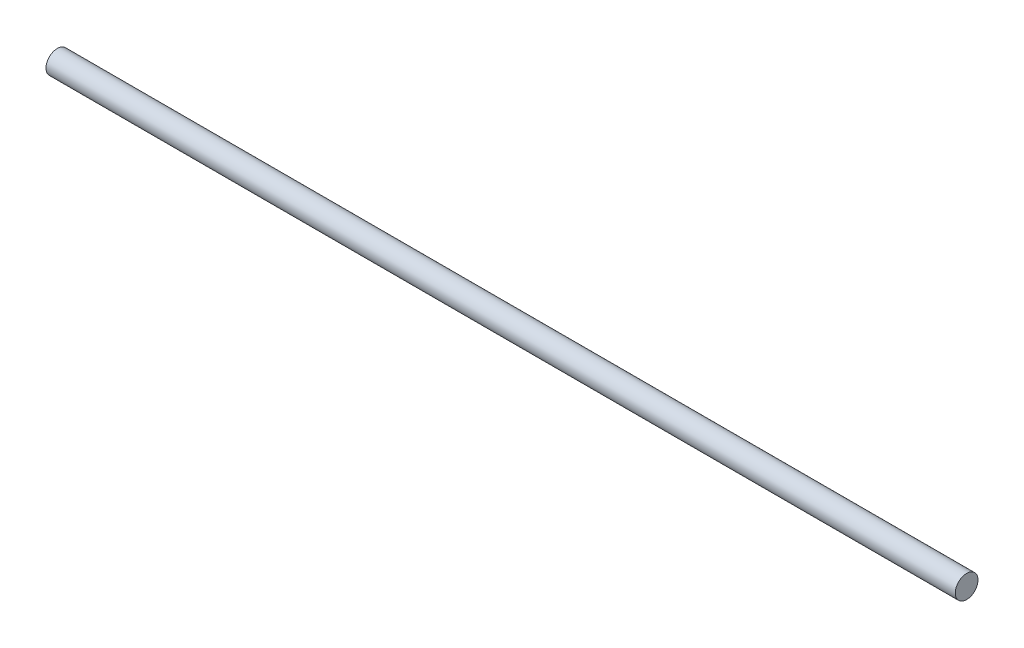
ISO-10303-21;
HEADER;
FILE_DESCRIPTION(('STEP AP214'),'2;1');
FILE_NAME('part.step','',(''),(''),'','','');
FILE_SCHEMA(('AUTOMOTIVE_DESIGN { 1 0 10303 214 1 1 1 1 }'));
ENDSEC;
DATA;
#1=APPLICATION_CONTEXT('core data for automotive mechanical design processes');
#2=APPLICATION_PROTOCOL_DEFINITION('international standard','automotive_design',2000,#1);
#3=PRODUCT_CONTEXT('',#1,'mechanical');
#4=PRODUCT('Part','Part','',(#3));
#5=PRODUCT_RELATED_PRODUCT_CATEGORY('part','',(#4));
#6=PRODUCT_DEFINITION_FORMATION('','',#4);
#7=PRODUCT_DEFINITION_CONTEXT('part definition',#1,'design');
#8=PRODUCT_DEFINITION('design','',#6,#7);
#9=PRODUCT_DEFINITION_SHAPE('','',#8);
#10=(LENGTH_UNIT() NAMED_UNIT(*) SI_UNIT(.MILLI.,.METRE.));
#11=(NAMED_UNIT(*) PLANE_ANGLE_UNIT() SI_UNIT($,.RADIAN.));
#12=(NAMED_UNIT(*) SI_UNIT($,.STERADIAN.) SOLID_ANGLE_UNIT());
#13=UNCERTAINTY_MEASURE_WITH_UNIT(LENGTH_MEASURE(1.E-05),#10,'distance_accuracy_value','');
#14=(GEOMETRIC_REPRESENTATION_CONTEXT(3) GLOBAL_UNCERTAINTY_ASSIGNED_CONTEXT((#13)) GLOBAL_UNIT_ASSIGNED_CONTEXT((#10,
#11,#12)) REPRESENTATION_CONTEXT('',''));
#15=CARTESIAN_POINT('',(0.,0.,0.));
#16=DIRECTION('',(0.,0.,1.));
#17=DIRECTION('',(1.,0.,0.));
#18=AXIS2_PLACEMENT_3D('',#15,#16,#17);
#19=CARTESIAN_POINT('',(500.,0.,0.));
#20=DIRECTION('',(-1.,0.,0.));
#21=DIRECTION('',(0.,0.,1.));
#22=AXIS2_PLACEMENT_3D('',#19,#20,#21);
#23=CYLINDRICAL_SURFACE('',#22,12.5000976668591);
#24=CARTESIAN_POINT('',(500.,0.,0.));
#25=DIRECTION('',(1.,0.,0.));
#26=DIRECTION('',(0.,0.,-1.));
#27=AXIS2_PLACEMENT_3D('',#24,#25,#26);
#28=CIRCLE('',#27,12.5000976668591);
#29=CARTESIAN_POINT('',(500.,0.,-12.5000976668591));
#30=VERTEX_POINT('',#29);
#31=EDGE_CURVE('E12',#30,#30,#28,.T.);
#32=ORIENTED_EDGE('',*,*,#31,.F.);
#33=EDGE_LOOP('',(#32));
#34=FACE_BOUND('',#33,.T.);
#35=CARTESIAN_POINT('',(-500.,0.,0.));
#36=DIRECTION('',(1.,0.,0.));
#37=DIRECTION('',(0.,0.,-1.));
#38=AXIS2_PLACEMENT_3D('',#35,#36,#37);
#39=CIRCLE('',#38,12.5000976668591);
#40=CARTESIAN_POINT('',(-500.,0.,-12.5000976668591));
#41=VERTEX_POINT('',#40);
#42=EDGE_CURVE('E47',#41,#41,#39,.T.);
#43=ORIENTED_EDGE('',*,*,#42,.T.);
#44=EDGE_LOOP('',(#43));
#45=FACE_BOUND('',#44,.T.);
#46=ADVANCED_FACE('F44',(#34,#45),#23,.T.);
#47=CARTESIAN_POINT('',(500.,0.,0.));
#48=DIRECTION('',(1.,0.,0.));
#49=DIRECTION('',(0.,0.,-1.));
#50=AXIS2_PLACEMENT_3D('',#47,#48,#49);
#51=PLANE('',#50);
#52=ORIENTED_EDGE('',*,*,#31,.T.);
#53=EDGE_LOOP('',(#52));
#54=FACE_BOUND('',#53,.T.);
#55=ADVANCED_FACE('F59',(#54),#51,.T.);
#56=CARTESIAN_POINT('',(-500.,0.,0.));
#57=DIRECTION('',(1.,0.,0.));
#58=DIRECTION('',(0.,0.,-1.));
#59=AXIS2_PLACEMENT_3D('',#56,#57,#58);
#60=PLANE('',#59);
#61=ORIENTED_EDGE('',*,*,#42,.F.);
#62=EDGE_LOOP('',(#61));
#63=FACE_BOUND('',#62,.T.);
#64=ADVANCED_FACE('F57',(#63),#60,.F.);
#65=CLOSED_SHELL('',(#46,#55,#64));
#66=MANIFOLD_SOLID_BREP('B2',#65);
#67=ADVANCED_BREP_SHAPE_REPRESENTATION('',(#18,#66),#14);
#68=SHAPE_DEFINITION_REPRESENTATION(#9,#67);
ENDSEC;
END-ISO-10303-21;
